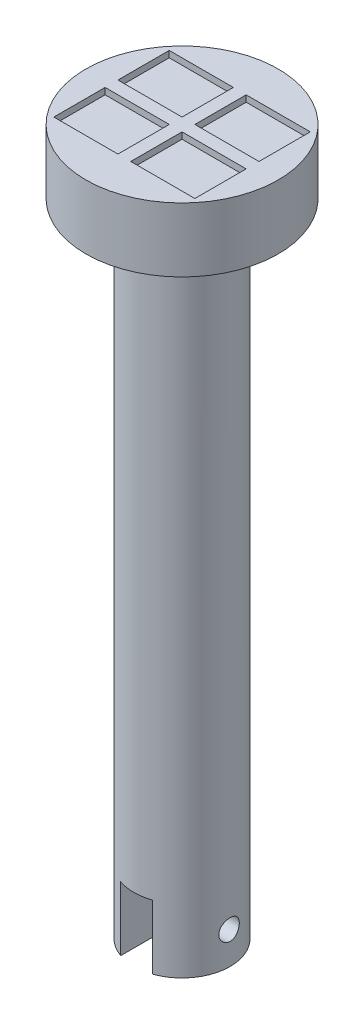
ISO-10303-21;
HEADER;
FILE_DESCRIPTION(('STEP AP214'),'2;1');
FILE_NAME('part.step','',(''),(''),'','','');
FILE_SCHEMA(('AUTOMOTIVE_DESIGN { 1 0 10303 214 1 1 1 1 }'));
ENDSEC;
DATA;
#1=APPLICATION_CONTEXT('core data for automotive mechanical design processes');
#2=APPLICATION_PROTOCOL_DEFINITION('international standard','automotive_design',2000,#1);
#3=PRODUCT_CONTEXT('',#1,'mechanical');
#4=PRODUCT('Part','Part','',(#3));
#5=PRODUCT_RELATED_PRODUCT_CATEGORY('part','',(#4));
#6=PRODUCT_DEFINITION_FORMATION('','',#4);
#7=PRODUCT_DEFINITION_CONTEXT('part definition',#1,'design');
#8=PRODUCT_DEFINITION('design','',#6,#7);
#9=PRODUCT_DEFINITION_SHAPE('','',#8);
#10=(LENGTH_UNIT() NAMED_UNIT(*) SI_UNIT(.MILLI.,.METRE.));
#11=(NAMED_UNIT(*) PLANE_ANGLE_UNIT() SI_UNIT($,.RADIAN.));
#12=(NAMED_UNIT(*) SI_UNIT($,.STERADIAN.) SOLID_ANGLE_UNIT());
#13=UNCERTAINTY_MEASURE_WITH_UNIT(LENGTH_MEASURE(1.E-05),#10,'distance_accuracy_value','');
#14=(GEOMETRIC_REPRESENTATION_CONTEXT(3) GLOBAL_UNCERTAINTY_ASSIGNED_CONTEXT((#13)) GLOBAL_UNIT_ASSIGNED_CONTEXT((#10,
#11,#12)) REPRESENTATION_CONTEXT('',''));
#15=CARTESIAN_POINT('',(0.,0.,0.));
#16=DIRECTION('',(0.,0.,1.));
#17=DIRECTION('',(1.,0.,0.));
#18=AXIS2_PLACEMENT_3D('',#15,#16,#17);
#19=CARTESIAN_POINT('',(0.,0.,0.));
#20=DIRECTION('',(0.,1.,0.));
#21=DIRECTION('',(0.,0.,1.));
#22=AXIS2_PLACEMENT_3D('',#19,#20,#21);
#23=PLANE('',#22);
#24=CARTESIAN_POINT('',(0.,0.,0.));
#25=DIRECTION('',(0.,1.,0.));
#26=DIRECTION('',(0.,0.,1.));
#27=AXIS2_PLACEMENT_3D('',#24,#25,#26);
#28=CIRCLE('',#27,7.5);
#29=CARTESIAN_POINT('',(-2.5,0.,-7.07106781186548));
#30=VERTEX_POINT('',#29);
#31=CARTESIAN_POINT('',(-2.5,0.,7.07106781186548));
#32=VERTEX_POINT('',#31);
#33=EDGE_CURVE('E377',#30,#32,#28,.T.);
#34=ORIENTED_EDGE('',*,*,#33,.F.);
#35=DIRECTION('',(0.,0.,1.));
#36=VECTOR('',#35,1.);
#37=CARTESIAN_POINT('',(-2.5,0.,0.));
#38=LINE('',#37,#36);
#39=EDGE_CURVE('E378',#30,#32,#38,.T.);
#40=ORIENTED_EDGE('',*,*,#39,.T.);
#41=EDGE_LOOP('',(#34,#40));
#42=FACE_BOUND('',#41,.T.);
#43=ADVANCED_FACE('F39',(#42),#23,.F.);
#44=CARTESIAN_POINT('',(0.,100.,0.));
#45=DIRECTION('',(0.,-1.,0.));
#46=DIRECTION('',(0.,0.,-1.));
#47=AXIS2_PLACEMENT_3D('',#44,#45,#46);
#48=CYLINDRICAL_SURFACE('',#47,7.5);
#49=CARTESIAN_POINT('',(-7.32734604068895,4.99999999999999,-1.6));
#50=CARTESIAN_POINT('',(-7.3273478320489,5.08876851007109,-1.59999687521768));
#51=CARTESIAN_POINT('',(-7.32897670533243,5.1775750992943,-1.59258752711157));
#52=CARTESIAN_POINT('',(-7.33530494590012,5.35266670741715,-1.56317603196586));
#53=CARTESIAN_POINT('',(-7.34000660314651,5.43894979556066,-1.54116300148996));
#54=CARTESIAN_POINT('',(-7.35192423987447,5.60643620667569,-1.48326555897742));
#55=CARTESIAN_POINT('',(-7.3591375365424,5.6876448412046,-1.44739594342864));
#56=CARTESIAN_POINT('',(-7.37526247893005,5.84289225870408,-1.36284536038589));
#57=CARTESIAN_POINT('',(-7.38417407205336,5.91693126361168,-1.31416478963062));
#58=CARTESIAN_POINT('',(-7.40285153964238,6.05692983916243,-1.20454002688148));
#59=CARTESIAN_POINT('',(-7.4126278874916,6.12275737738522,-1.14342897607145));
#60=CARTESIAN_POINT('',(-7.43184148234544,6.24330916231062,-1.01103827358584));
#61=CARTESIAN_POINT('',(-7.44127870373573,6.29803257175974,-0.9397578558276));
#62=CARTESIAN_POINT('',(-7.45886446546389,6.39534204711686,-0.788169783859917));
#63=CARTESIAN_POINT('',(-7.46699920907061,6.4378015699902,-0.707779159305541));
#64=CARTESIAN_POINT('',(-7.48094533800134,6.50855994533144,-0.540801563567203));
#65=CARTESIAN_POINT('',(-7.48675697112518,6.53686030819921,-0.454215254422203));
#66=CARTESIAN_POINT('',(-7.4953280596337,6.57808300960865,-0.278676257286044));
#67=CARTESIAN_POINT('',(-7.49813179441585,6.59122866317341,-0.189778209864773));
#68=CARTESIAN_POINT('',(-7.5005244520832,6.60246656338555,-0.010997287248264));
#69=CARTESIAN_POINT('',(-7.50011372555284,6.6005604516498,0.0788854794810483));
#70=CARTESIAN_POINT('',(-7.49615771852237,6.58191615631797,0.255546402374115));
#71=CARTESIAN_POINT('',(-7.49266329963279,6.56541862972291,0.342351262803162));
#72=CARTESIAN_POINT('',(-7.48299031427627,6.51844277484242,0.511931382190346));
#73=CARTESIAN_POINT('',(-7.47681163040705,6.48796383504569,0.594706464721115));
#74=CARTESIAN_POINT('',(-7.46238195623954,6.41367449572028,0.75455088288095));
#75=CARTESIAN_POINT('',(-7.45411671633686,6.36977196910885,0.831576062489073));
#76=CARTESIAN_POINT('',(-7.43642166419509,6.2699502243687,0.977254151163989));
#77=CARTESIAN_POINT('',(-7.4269917006231,6.21402944400459,1.04590596996944));
#78=CARTESIAN_POINT('',(-7.40778511114789,6.09044536673716,1.17431898714989));
#79=CARTESIAN_POINT('',(-7.39800531840365,6.02257143781813,1.23387717194844));
#80=CARTESIAN_POINT('',(-7.37937693038443,5.87769857523078,1.34080220178097));
#81=CARTESIAN_POINT('',(-7.37052835793311,5.80069941800689,1.38816874804634));
#82=CARTESIAN_POINT('',(-7.35475651444397,5.63944452104653,1.46945010087399));
#83=CARTESIAN_POINT('',(-7.34783851514439,5.55516971894304,1.50332818047938));
#84=CARTESIAN_POINT('',(-7.33678531116542,5.38194121509157,1.55638146230778));
#85=CARTESIAN_POINT('',(-7.33264968873186,5.29298821790475,1.57555887179257));
#86=CARTESIAN_POINT('',(-7.32771425542105,5.11477894000118,1.59835496135295));
#87=CARTESIAN_POINT('',(-7.32685123090565,5.02556208684322,1.60226852153074));
#88=CARTESIAN_POINT('',(-7.32838843572104,4.8477506677869,1.59522273599979));
#89=CARTESIAN_POINT('',(-7.33078845261626,4.75915606175547,1.58426435850705));
#90=CARTESIAN_POINT('',(-7.33852177157955,4.58612016761892,1.54804113817799));
#91=CARTESIAN_POINT('',(-7.34382205072082,4.50164357089464,1.52293726454489));
#92=CARTESIAN_POINT('',(-7.35672914405465,4.33809550071399,1.45930930111439));
#93=CARTESIAN_POINT('',(-7.36433617007512,4.25902452447174,1.42078397878081));
#94=CARTESIAN_POINT('',(-7.38113944964658,4.10725190691673,1.3307517679701));
#95=CARTESIAN_POINT('',(-7.39035742068727,4.03466097902885,1.27906237846837));
#96=CARTESIAN_POINT('',(-7.40928600589101,3.89907535110418,1.16440942349652));
#97=CARTESIAN_POINT('',(-7.41899667801202,3.83608178353944,1.10144452944021));
#98=CARTESIAN_POINT('',(-7.43802394390858,3.72034234685535,0.964696649513289));
#99=CARTESIAN_POINT('',(-7.44733055372857,3.66779703072941,0.8907422998811));
#100=CARTESIAN_POINT('',(-7.46432047157701,3.57587637439103,0.734884872162142));
#101=CARTESIAN_POINT('',(-7.47200385334325,3.53650043589062,0.65298215538974));
#102=CARTESIAN_POINT('',(-7.48483934479639,3.47231945842674,0.484049906499258));
#103=CARTESIAN_POINT('',(-7.49000699441327,3.44742477608375,0.397055665841016));
#104=CARTESIAN_POINT('',(-7.49729580275604,3.41263173205882,0.219997709997886));
#105=CARTESIAN_POINT('',(-7.49941738166686,3.40273130201045,0.129934419922702));
#106=CARTESIAN_POINT('',(-7.50036328067436,3.39829699175498,-0.0487977681305956));
#107=CARTESIAN_POINT('',(-7.49925198227476,3.40346307298598,-0.137459015607026));
#108=CARTESIAN_POINT('',(-7.49399416638132,3.42834658015261,-0.312618673313174));
#109=CARTESIAN_POINT('',(-7.48984769836304,3.44806376889427,-0.399117118774427));
#110=CARTESIAN_POINT('',(-7.47898934152454,3.50134901504737,-0.567277052878255));
#111=CARTESIAN_POINT('',(-7.47228498421878,3.53487643213245,-0.64895193649736));
#112=CARTESIAN_POINT('',(-7.45702850620361,3.61479002736396,-0.805557846294829));
#113=CARTESIAN_POINT('',(-7.44847621571813,3.66117738710898,-0.880488251937902));
#114=CARTESIAN_POINT('',(-7.43026476347602,3.76648248217596,-1.02294779578885));
#115=CARTESIAN_POINT('',(-7.42058833247677,3.82561231982063,-1.09031795731115));
#116=CARTESIAN_POINT('',(-7.40131497163696,3.95429363888893,-1.21428232218523));
#117=CARTESIAN_POINT('',(-7.39171806140063,4.02384761397617,-1.27087393971624));
#118=CARTESIAN_POINT('',(-7.37355623892386,4.17245456146851,-1.37235806742357));
#119=CARTESIAN_POINT('',(-7.36500582897484,4.25161602988675,-1.41709443670196));
#120=CARTESIAN_POINT('',(-7.3500858193436,4.41649726202727,-1.49255808840325));
#121=CARTESIAN_POINT('',(-7.34371433542935,4.5022112805218,-1.5232974824127));
#122=CARTESIAN_POINT('',(-7.33507966715627,4.65670463156019,-1.56426527791603));
#123=CARTESIAN_POINT('',(-7.3321984207885,4.72463247703799,-1.57764062026348));
#124=CARTESIAN_POINT('',(-7.32833095153541,4.86169921223266,-1.59550900254637));
#125=CARTESIAN_POINT('',(-7.32734464499187,4.93083804835045,-1.60000243460258));
#126=CARTESIAN_POINT('',(-7.32734604068895,4.99999999999999,-1.6));
#127=B_SPLINE_CURVE_WITH_KNOTS('',3,(#49,#50,#51,#52,#53,#54,#55,#56,#57,#58,#59,#60,#61,#62,
#63,#64,#65,#66,#67,#68,#69,#70,#71,#72,#73,#74,#75,#76,#77,#78,#79,#80,#81,#82,#83,#84,#85,#86,
#87,#88,#89,#90,#91,#92,#93,#94,#95,#96,#97,#98,#99,#100,#101,#102,#103,#104,#105,#106,#107,
#108,#109,#110,#111,#112,#113,#114,#115,#116,#117,#118,#119,#120,#121,#122,#123,#124,#125,#126),
.UNSPECIFIED.,.T.,.F.,(4,2,2,2,2,2,2,2,2,2,2,2,2,2,2,2,2,2,2,2,2,2,2,2,2,2,2,2,2,2,2,2,2,2,2,2,
2,2,4),(0.,0.266052129745754,0.532302758678047,0.798269859408134,1.06422872445041,
1.33402614177927,1.60384389433342,1.87635365044247,2.14883433092115,2.41724632343608,
2.68562904207089,2.94966617354387,3.21371485442776,3.47961802162733,3.74555577412269,
4.01676058380499,4.28797203900695,4.55991699098621,4.83182110323962,5.09844553370914,
5.36505260681318,5.62868536677038,5.89234234338366,6.15987500944547,6.42743921949375,
6.69972716505267,6.97200273882469,7.24257439749417,7.51310872903873,7.7782925828225,
8.04347211400599,8.30787679551559,8.57230577914046,8.84153310165343,9.11082493186948,
9.38350466142433,9.65594799064849,9.86324556645522,10.0705339902329),.UNSPECIFIED.);
#128=CARTESIAN_POINT('',(-7.32734604068895,4.99999999999999,-1.6));
#129=VERTEX_POINT('',#128);
#130=EDGE_CURVE('E322',#129,#129,#127,.T.);
#131=ORIENTED_EDGE('',*,*,#130,.T.);
#132=EDGE_LOOP('',(#131));
#133=FACE_BOUND('',#132,.T.);
#134=CARTESIAN_POINT('',(7.32734604068895,4.99999999999999,-1.6));
#135=CARTESIAN_POINT('',(7.3273478320489,4.9112314899289,-1.59999687521768));
#136=CARTESIAN_POINT('',(7.32897670533243,4.82242490070569,-1.59258752711157));
#137=CARTESIAN_POINT('',(7.33530494590012,4.64733329258284,-1.56317603196586));
#138=CARTESIAN_POINT('',(7.34000660314651,4.56105020443933,-1.54116300148996));
#139=CARTESIAN_POINT('',(7.35192423987447,4.3935637933243,-1.48326555897742));
#140=CARTESIAN_POINT('',(7.3591375365424,4.31235515879539,-1.44739594342864));
#141=CARTESIAN_POINT('',(7.37526247893005,4.15710774129591,-1.36284536038589));
#142=CARTESIAN_POINT('',(7.38417407205336,4.08306873638831,-1.31416478963062));
#143=CARTESIAN_POINT('',(7.40285153964238,3.94307016083756,-1.20454002688148));
#144=CARTESIAN_POINT('',(7.4126278874916,3.87724262261477,-1.14342897607145));
#145=CARTESIAN_POINT('',(7.43184148234544,3.75669083768937,-1.01103827358584));
#146=CARTESIAN_POINT('',(7.44127870373573,3.70196742824025,-0.9397578558276));
#147=CARTESIAN_POINT('',(7.45886446546389,3.60465795288313,-0.788169783859917));
#148=CARTESIAN_POINT('',(7.46699920907061,3.56219843000979,-0.707779159305541));
#149=CARTESIAN_POINT('',(7.48094533800134,3.49144005466855,-0.540801563567203));
#150=CARTESIAN_POINT('',(7.48675697112518,3.46313969180078,-0.454215254422203));
#151=CARTESIAN_POINT('',(7.4953280596337,3.42191699039134,-0.278676257286044));
#152=CARTESIAN_POINT('',(7.49813179441585,3.40877133682658,-0.189778209864773));
#153=CARTESIAN_POINT('',(7.5005244520832,3.39753343661444,-0.0109972872482639));
#154=CARTESIAN_POINT('',(7.50011372555284,3.39943954835019,0.0788854794810484));
#155=CARTESIAN_POINT('',(7.49615771852237,3.41808384368202,0.255546402374115));
#156=CARTESIAN_POINT('',(7.49266329963279,3.43458137027708,0.342351262803162));
#157=CARTESIAN_POINT('',(7.48299031427627,3.48155722515757,0.511931382190346));
#158=CARTESIAN_POINT('',(7.47681163040705,3.5120361649543,0.594706464721115));
#159=CARTESIAN_POINT('',(7.46238195623954,3.58632550427971,0.75455088288095));
#160=CARTESIAN_POINT('',(7.45411671633686,3.63022803089114,0.831576062489073));
#161=CARTESIAN_POINT('',(7.43642166419509,3.73004977563129,0.977254151163989));
#162=CARTESIAN_POINT('',(7.4269917006231,3.7859705559954,1.04590596996944));
#163=CARTESIAN_POINT('',(7.40778511114788,3.90955463326283,1.1743189871499));
#164=CARTESIAN_POINT('',(7.39800531840364,3.97742856218186,1.23387717194844));
#165=CARTESIAN_POINT('',(7.37937693038443,4.12230142476921,1.34080220178098));
#166=CARTESIAN_POINT('',(7.37052835793311,4.1993005819931,1.38816874804634));
#167=CARTESIAN_POINT('',(7.35475651444397,4.36055547895346,1.46945010087399));
#168=CARTESIAN_POINT('',(7.34783851514439,4.44483028105695,1.50332818047938));
#169=CARTESIAN_POINT('',(7.33678531116542,4.61805878490842,1.55638146230778));
#170=CARTESIAN_POINT('',(7.33264968873186,4.70701178209524,1.57555887179257));
#171=CARTESIAN_POINT('',(7.32771425542105,4.88522105999881,1.59835496135295));
#172=CARTESIAN_POINT('',(7.32685123090565,4.97443791315677,1.60226852153074));
#173=CARTESIAN_POINT('',(7.32838843572104,5.15224933221309,1.59522273599979));
#174=CARTESIAN_POINT('',(7.33078845261626,5.24084393824452,1.58426435850705));
#175=CARTESIAN_POINT('',(7.33852177157955,5.41387983238107,1.54804113817799));
#176=CARTESIAN_POINT('',(7.34382205072082,5.49835642910535,1.52293726454489));
#177=CARTESIAN_POINT('',(7.35672914405465,5.661904499286,1.45930930111439));
#178=CARTESIAN_POINT('',(7.36433617007512,5.74097547552824,1.42078397878081));
#179=CARTESIAN_POINT('',(7.38113944964658,5.89274809308326,1.3307517679701));
#180=CARTESIAN_POINT('',(7.39035742068727,5.96533902097114,1.27906237846837));
#181=CARTESIAN_POINT('',(7.40928600589101,6.10092464889581,1.16440942349652));
#182=CARTESIAN_POINT('',(7.41899667801202,6.16391821646055,1.10144452944021));
#183=CARTESIAN_POINT('',(7.43802394390858,6.27965765314464,0.964696649513289));
#184=CARTESIAN_POINT('',(7.44733055372857,6.33220296927058,0.890742299881099));
#185=CARTESIAN_POINT('',(7.46432047157701,6.42412362560896,0.734884872162141));
#186=CARTESIAN_POINT('',(7.47200385334325,6.46349956410937,0.65298215538974));
#187=CARTESIAN_POINT('',(7.48483934479639,6.52768054157325,0.484049906499258));
#188=CARTESIAN_POINT('',(7.49000699441327,6.55257522391624,0.397055665841016));
#189=CARTESIAN_POINT('',(7.49729580275604,6.58736826794117,0.219997709997886));
#190=CARTESIAN_POINT('',(7.49941738166686,6.59726869798954,0.129934419922702));
#191=CARTESIAN_POINT('',(7.50036328067436,6.60170300824501,-0.0487977681305959));
#192=CARTESIAN_POINT('',(7.49925198227476,6.59653692701401,-0.137459015607026));
#193=CARTESIAN_POINT('',(7.49399416638132,6.57165341984738,-0.312618673313175));
#194=CARTESIAN_POINT('',(7.48984769836304,6.55193623110572,-0.399117118774427));
#195=CARTESIAN_POINT('',(7.47898934152454,6.49865098495262,-0.567277052878256));
#196=CARTESIAN_POINT('',(7.47228498421878,6.46512356786754,-0.648951936497361));
#197=CARTESIAN_POINT('',(7.45702850620361,6.38520997263603,-0.80555784629483));
#198=CARTESIAN_POINT('',(7.44847621571813,6.33882261289101,-0.880488251937902));
#199=CARTESIAN_POINT('',(7.43026476347602,6.23351751782403,-1.02294779578885));
#200=CARTESIAN_POINT('',(7.42058833247677,6.17438768017936,-1.09031795731115));
#201=CARTESIAN_POINT('',(7.40131497163696,6.04570636111105,-1.21428232218523));
#202=CARTESIAN_POINT('',(7.39171806140063,5.97615238602382,-1.27087393971624));
#203=CARTESIAN_POINT('',(7.37355623892386,5.82754543853147,-1.37235806742357));
#204=CARTESIAN_POINT('',(7.36500582897484,5.74838397011324,-1.41709443670196));
#205=CARTESIAN_POINT('',(7.3500858193436,5.58350273797272,-1.49255808840325));
#206=CARTESIAN_POINT('',(7.34371433542935,5.49778871947819,-1.5232974824127));
#207=CARTESIAN_POINT('',(7.33507966715627,5.3432953684398,-1.56426527791603));
#208=CARTESIAN_POINT('',(7.3321984207885,5.275367522962,-1.57764062026348));
#209=CARTESIAN_POINT('',(7.32833095153541,5.13830078776733,-1.59550900254637));
#210=CARTESIAN_POINT('',(7.32734464499187,5.06916195164954,-1.60000243460258));
#211=CARTESIAN_POINT('',(7.32734604068895,4.99999999999999,-1.6));
#212=B_SPLINE_CURVE_WITH_KNOTS('',3,(#134,#135,#136,#137,#138,#139,#140,#141,#142,#143,#144,
#145,#146,#147,#148,#149,#150,#151,#152,#153,#154,#155,#156,#157,#158,#159,#160,#161,#162,#163,
#164,#165,#166,#167,#168,#169,#170,#171,#172,#173,#174,#175,#176,#177,#178,#179,#180,#181,#182,
#183,#184,#185,#186,#187,#188,#189,#190,#191,#192,#193,#194,#195,#196,#197,#198,#199,#200,#201,
#202,#203,#204,#205,#206,#207,#208,#209,#210,#211),.UNSPECIFIED.,.T.,.F.,(4,2,2,2,2,2,2,2,2,2,2,
2,2,2,2,2,2,2,2,2,2,2,2,2,2,2,2,2,2,2,2,2,2,2,2,2,2,2,4),(0.,0.266052129745754,
0.532302758678047,0.798269859408134,1.06422872445041,1.33402614177927,1.60384389433342,
1.87635365044247,2.14883433092115,2.41724632343608,2.68562904207089,2.94966617354387,
3.21371485442776,3.47961802162733,3.74555577412269,4.01676058380499,4.28797203900696,
4.55991699098621,4.83182110323962,5.09844553370915,5.36505260681318,5.62868536677038,
5.89234234338366,6.15987500944547,6.42743921949375,6.69972716505267,6.97200273882469,
7.24257439749418,7.51310872903873,7.7782925828225,8.04347211400599,8.30787679551559,
8.57230577914047,8.84153310165343,9.11082493186948,9.38350466142433,9.65594799064849,
9.86324556645522,10.0705339902329),.UNSPECIFIED.);
#213=CARTESIAN_POINT('',(7.32734604068895,4.99999999999999,-1.6));
#214=VERTEX_POINT('',#213);
#215=EDGE_CURVE('E315',#214,#214,#212,.T.);
#216=ORIENTED_EDGE('',*,*,#215,.T.);
#217=EDGE_LOOP('',(#216));
#218=FACE_BOUND('',#217,.T.);
#219=CARTESIAN_POINT('',(0.,100.,0.));
#220=DIRECTION('',(0.,1.,0.));
#221=DIRECTION('',(0.,0.,1.));
#222=AXIS2_PLACEMENT_3D('',#219,#220,#221);
#223=CIRCLE('',#222,7.5);
#224=CARTESIAN_POINT('',(0.,100.,7.5));
#225=VERTEX_POINT('',#224);
#226=EDGE_CURVE('E386',#225,#225,#223,.T.);
#227=ORIENTED_EDGE('',*,*,#226,.F.);
#228=EDGE_LOOP('',(#227));
#229=FACE_BOUND('',#228,.T.);
#230=ORIENTED_EDGE('',*,*,#33,.T.);
#231=DIRECTION('',(0.,-1.,0.));
#232=VECTOR('',#231,1.);
#233=CARTESIAN_POINT('',(-2.50000000000001,100.,7.07106781186547));
#234=LINE('',#233,#232);
#235=CARTESIAN_POINT('',(-2.5,9.99999999999999,7.07106781186548));
#236=VERTEX_POINT('',#235);
#237=EDGE_CURVE('E414',#32,#236,#234,.F.);
#238=ORIENTED_EDGE('',*,*,#237,.T.);
#239=CARTESIAN_POINT('',(0.,9.99999999999999,0.));
#240=DIRECTION('',(0.,1.,0.));
#241=DIRECTION('',(0.,0.,1.));
#242=AXIS2_PLACEMENT_3D('',#239,#240,#241);
#243=CIRCLE('',#242,7.5);
#244=CARTESIAN_POINT('',(2.5,10.,7.07106781186548));
#245=VERTEX_POINT('',#244);
#246=EDGE_CURVE('E11',#236,#245,#243,.T.);
#247=ORIENTED_EDGE('',*,*,#246,.T.);
#248=DIRECTION('',(0.,-1.,0.));
#249=VECTOR('',#248,1.);
#250=CARTESIAN_POINT('',(2.49999999999999,100.,7.07106781186548));
#251=LINE('',#250,#249);
#252=CARTESIAN_POINT('',(2.5,0.,7.07106781186548));
#253=VERTEX_POINT('',#252);
#254=EDGE_CURVE('E408',#245,#253,#251,.T.);
#255=ORIENTED_EDGE('',*,*,#254,.T.);
#256=CARTESIAN_POINT('',(2.5,0.,-7.07106781186548));
#257=VERTEX_POINT('',#256);
#258=EDGE_CURVE('E382',#253,#257,#28,.T.);
#259=ORIENTED_EDGE('',*,*,#258,.T.);
#260=DIRECTION('',(0.,-1.,0.));
#261=VECTOR('',#260,1.);
#262=CARTESIAN_POINT('',(2.49999999999999,100.,-7.07106781186548));
#263=LINE('',#262,#261);
#264=CARTESIAN_POINT('',(2.5,10.,-7.07106781186548));
#265=VERTEX_POINT('',#264);
#266=EDGE_CURVE('E399',#257,#265,#263,.F.);
#267=ORIENTED_EDGE('',*,*,#266,.T.);
#268=CARTESIAN_POINT('',(-2.5,9.99999999999999,-7.07106781186548));
#269=VERTEX_POINT('',#268);
#270=EDGE_CURVE('E49',#265,#269,#243,.T.);
#271=ORIENTED_EDGE('',*,*,#270,.T.);
#272=DIRECTION('',(0.,-1.,0.));
#273=VECTOR('',#272,1.);
#274=CARTESIAN_POINT('',(-2.50000000000001,100.,-7.07106781186547));
#275=LINE('',#274,#273);
#276=EDGE_CURVE('E398',#269,#30,#275,.T.);
#277=ORIENTED_EDGE('',*,*,#276,.T.);
#278=EDGE_LOOP('',(#230,#238,#247,#255,#259,#267,#271,#277));
#279=FACE_BOUND('',#278,.T.);
#280=ADVANCED_FACE('F41',(#133,#218,#229,#279),#48,.T.);
#281=ORIENTED_EDGE('',*,*,#258,.F.);
#282=DIRECTION('',(0.,0.,-1.));
#283=VECTOR('',#282,1.);
#284=CARTESIAN_POINT('',(2.5,0.,0.));
#285=LINE('',#284,#283);
#286=EDGE_CURVE('E393',#253,#257,#285,.T.);
#287=ORIENTED_EDGE('',*,*,#286,.T.);
#288=EDGE_LOOP('',(#281,#287));
#289=FACE_BOUND('',#288,.T.);
#290=ADVANCED_FACE('F359',(#289),#23,.F.);
#291=CARTESIAN_POINT('',(0.,110.,0.));
#292=DIRECTION('',(0.,-1.,0.));
#293=DIRECTION('',(0.,0.,-1.));
#294=AXIS2_PLACEMENT_3D('',#291,#292,#293);
#295=CYLINDRICAL_SURFACE('',#294,15.);
#296=CARTESIAN_POINT('',(0.,110.,0.));
#297=DIRECTION('',(0.,1.,0.));
#298=DIRECTION('',(0.,0.,1.));
#299=AXIS2_PLACEMENT_3D('',#296,#297,#298);
#300=CIRCLE('',#299,15.);
#301=CARTESIAN_POINT('',(0.,110.,15.));
#302=VERTEX_POINT('',#301);
#303=EDGE_CURVE('E383',#302,#302,#300,.T.);
#304=ORIENTED_EDGE('',*,*,#303,.F.);
#305=EDGE_LOOP('',(#304));
#306=FACE_BOUND('',#305,.T.);
#307=CARTESIAN_POINT('',(0.,100.,0.));
#308=DIRECTION('',(0.,1.,0.));
#309=DIRECTION('',(0.,0.,1.));
#310=AXIS2_PLACEMENT_3D('',#307,#308,#309);
#311=CIRCLE('',#310,15.);
#312=CARTESIAN_POINT('',(0.,100.,15.));
#313=VERTEX_POINT('',#312);
#314=EDGE_CURVE('E388',#313,#313,#311,.T.);
#315=ORIENTED_EDGE('',*,*,#314,.T.);
#316=EDGE_LOOP('',(#315));
#317=FACE_BOUND('',#316,.T.);
#318=ADVANCED_FACE('F353',(#306,#317),#295,.T.);
#319=CARTESIAN_POINT('',(0.,110.,0.));
#320=DIRECTION('',(0.,1.,0.));
#321=DIRECTION('',(0.,0.,1.));
#322=AXIS2_PLACEMENT_3D('',#319,#320,#321);
#323=PLANE('',#322);
#324=DIRECTION('',(0.,0.,1.));
#325=VECTOR('',#324,1.);
#326=CARTESIAN_POINT('',(-11.,110.,9.00000000000001));
#327=LINE('',#326,#325);
#328=CARTESIAN_POINT('',(-11.,110.,1.00000000000001));
#329=VERTEX_POINT('',#328);
#330=CARTESIAN_POINT('',(-11.,110.,9.00000000000001));
#331=VERTEX_POINT('',#330);
#332=EDGE_CURVE('E56',#329,#331,#327,.T.);
#333=ORIENTED_EDGE('',*,*,#332,.F.);
#334=DIRECTION('',(-1.,0.,0.));
#335=VECTOR('',#334,1.);
#336=CARTESIAN_POINT('',(-11.,110.,1.00000000000001));
#337=LINE('',#336,#335);
#338=CARTESIAN_POINT('',(-1.,110.,1.));
#339=VERTEX_POINT('',#338);
#340=EDGE_CURVE('E256',#339,#329,#337,.T.);
#341=ORIENTED_EDGE('',*,*,#340,.F.);
#342=DIRECTION('',(0.,0.,-1.));
#343=VECTOR('',#342,1.);
#344=CARTESIAN_POINT('',(-0.999999999999997,110.,9.));
#345=LINE('',#344,#343);
#346=CARTESIAN_POINT('',(-0.999999999999997,110.,9.));
#347=VERTEX_POINT('',#346);
#348=EDGE_CURVE('E270',#347,#339,#345,.T.);
#349=ORIENTED_EDGE('',*,*,#348,.F.);
#350=DIRECTION('',(1.,0.,0.));
#351=VECTOR('',#350,1.);
#352=CARTESIAN_POINT('',(-11.,110.,9.00000000000001));
#353=LINE('',#352,#351);
#354=EDGE_CURVE('E267',#331,#347,#353,.T.);
#355=ORIENTED_EDGE('',*,*,#354,.F.);
#356=EDGE_LOOP('',(#333,#341,#349,#355));
#357=FACE_BOUND('',#356,.T.);
#358=DIRECTION('',(1.,0.,0.));
#359=VECTOR('',#358,1.);
#360=CARTESIAN_POINT('',(11.,110.,9.00000000000001));
#361=LINE('',#360,#359);
#362=CARTESIAN_POINT('',(1.,110.,9.));
#363=VERTEX_POINT('',#362);
#364=CARTESIAN_POINT('',(11.,110.,9.00000000000001));
#365=VERTEX_POINT('',#364);
#366=EDGE_CURVE('E64',#363,#365,#361,.T.);
#367=ORIENTED_EDGE('',*,*,#366,.F.);
#368=DIRECTION('',(0.,0.,1.));
#369=VECTOR('',#368,1.);
#370=CARTESIAN_POINT('',(1.,110.,9.));
#371=LINE('',#370,#369);
#372=CARTESIAN_POINT('',(1.00000000000001,110.,1.));
#373=VERTEX_POINT('',#372);
#374=EDGE_CURVE('E226',#373,#363,#371,.T.);
#375=ORIENTED_EDGE('',*,*,#374,.F.);
#376=DIRECTION('',(-1.,0.,0.));
#377=VECTOR('',#376,1.);
#378=CARTESIAN_POINT('',(11.,110.,1.));
#379=LINE('',#378,#377);
#380=CARTESIAN_POINT('',(11.,110.,1.));
#381=VERTEX_POINT('',#380);
#382=EDGE_CURVE('E241',#381,#373,#379,.T.);
#383=ORIENTED_EDGE('',*,*,#382,.F.);
#384=DIRECTION('',(0.,0.,-1.));
#385=VECTOR('',#384,1.);
#386=CARTESIAN_POINT('',(11.,110.,9.00000000000001));
#387=LINE('',#386,#385);
#388=EDGE_CURVE('E237',#365,#381,#387,.T.);
#389=ORIENTED_EDGE('',*,*,#388,.F.);
#390=EDGE_LOOP('',(#367,#375,#383,#389));
#391=FACE_BOUND('',#390,.T.);
#392=DIRECTION('',(0.,0.,-1.));
#393=VECTOR('',#392,1.);
#394=CARTESIAN_POINT('',(11.,110.,-9.00000000000001));
#395=LINE('',#394,#393);
#396=CARTESIAN_POINT('',(11.,110.,-1.));
#397=VERTEX_POINT('',#396);
#398=CARTESIAN_POINT('',(11.,110.,-9.00000000000001));
#399=VERTEX_POINT('',#398);
#400=EDGE_CURVE('E185',#397,#399,#395,.T.);
#401=ORIENTED_EDGE('',*,*,#400,.F.);
#402=DIRECTION('',(1.,0.,0.));
#403=VECTOR('',#402,1.);
#404=CARTESIAN_POINT('',(11.,110.,-1.));
#405=LINE('',#404,#403);
#406=CARTESIAN_POINT('',(1.00000000000001,110.,-1.));
#407=VERTEX_POINT('',#406);
#408=EDGE_CURVE('E202',#407,#397,#405,.T.);
#409=ORIENTED_EDGE('',*,*,#408,.F.);
#410=DIRECTION('',(0.,0.,1.));
#411=VECTOR('',#410,1.);
#412=CARTESIAN_POINT('',(1.,110.,-9.));
#413=LINE('',#412,#411);
#414=CARTESIAN_POINT('',(1.,110.,-9.));
#415=VERTEX_POINT('',#414);
#416=EDGE_CURVE('E205',#415,#407,#413,.T.);
#417=ORIENTED_EDGE('',*,*,#416,.F.);
#418=DIRECTION('',(-1.,0.,0.));
#419=VECTOR('',#418,1.);
#420=CARTESIAN_POINT('',(11.,110.,-9.00000000000001));
#421=LINE('',#420,#419);
#422=EDGE_CURVE('E211',#399,#415,#421,.T.);
#423=ORIENTED_EDGE('',*,*,#422,.F.);
#424=EDGE_LOOP('',(#401,#409,#417,#423));
#425=FACE_BOUND('',#424,.T.);
#426=DIRECTION('',(0.,0.,1.));
#427=VECTOR('',#426,1.);
#428=CARTESIAN_POINT('',(-11.,110.,-9.));
#429=LINE('',#428,#427);
#430=CARTESIAN_POINT('',(-11.,110.,-9.));
#431=VERTEX_POINT('',#430);
#432=CARTESIAN_POINT('',(-11.,110.,-1.));
#433=VERTEX_POINT('',#432);
#434=EDGE_CURVE('E218',#431,#433,#429,.T.);
#435=ORIENTED_EDGE('',*,*,#434,.F.);
#436=DIRECTION('',(-1.,0.,0.));
#437=VECTOR('',#436,1.);
#438=CARTESIAN_POINT('',(-11.,110.,-9.));
#439=LINE('',#438,#437);
#440=CARTESIAN_POINT('',(-1.,110.,-9.));
#441=VERTEX_POINT('',#440);
#442=EDGE_CURVE('E285',#441,#431,#439,.T.);
#443=ORIENTED_EDGE('',*,*,#442,.F.);
#444=DIRECTION('',(0.,0.,-1.));
#445=VECTOR('',#444,1.);
#446=CARTESIAN_POINT('',(-1.,110.,-9.));
#447=LINE('',#446,#445);
#448=CARTESIAN_POINT('',(-1.,110.,-1.));
#449=VERTEX_POINT('',#448);
#450=EDGE_CURVE('E299',#449,#441,#447,.T.);
#451=ORIENTED_EDGE('',*,*,#450,.F.);
#452=DIRECTION('',(1.,0.,0.));
#453=VECTOR('',#452,1.);
#454=CARTESIAN_POINT('',(-11.,110.,-1.));
#455=LINE('',#454,#453);
#456=EDGE_CURVE('E296',#433,#449,#455,.T.);
#457=ORIENTED_EDGE('',*,*,#456,.F.);
#458=EDGE_LOOP('',(#435,#443,#451,#457));
#459=FACE_BOUND('',#458,.T.);
#460=ORIENTED_EDGE('',*,*,#303,.T.);
#461=EDGE_LOOP('',(#460));
#462=FACE_BOUND('',#461,.T.);
#463=ADVANCED_FACE('F350',(#357,#391,#425,#459,#462),#323,.T.);
#464=CARTESIAN_POINT('',(0.,100.,0.));
#465=DIRECTION('',(0.,1.,0.));
#466=DIRECTION('',(0.,0.,1.));
#467=AXIS2_PLACEMENT_3D('',#464,#465,#466);
#468=PLANE('',#467);
#469=ORIENTED_EDGE('',*,*,#226,.T.);
#470=EDGE_LOOP('',(#469));
#471=FACE_BOUND('',#470,.T.);
#472=ORIENTED_EDGE('',*,*,#314,.F.);
#473=EDGE_LOOP('',(#472));
#474=FACE_BOUND('',#473,.T.);
#475=ADVANCED_FACE('F341',(#471,#474),#468,.F.);
#476=CARTESIAN_POINT('',(-2.5,10.,-15.));
#477=DIRECTION('',(0.,1.,0.));
#478=DIRECTION('',(0.,0.,1.));
#479=AXIS2_PLACEMENT_3D('',#476,#477,#478);
#480=PLANE('',#479);
#481=DIRECTION('',(0.,0.,1.));
#482=VECTOR('',#481,1.);
#483=CARTESIAN_POINT('',(2.5,10.,-15.));
#484=LINE('',#483,#482);
#485=EDGE_CURVE('E403',#265,#245,#484,.T.);
#486=ORIENTED_EDGE('',*,*,#485,.T.);
#487=ORIENTED_EDGE('',*,*,#246,.F.);
#488=DIRECTION('',(0.,0.,1.));
#489=VECTOR('',#488,1.);
#490=CARTESIAN_POINT('',(-2.5,10.,-15.));
#491=LINE('',#490,#489);
#492=EDGE_CURVE('E405',#269,#236,#491,.T.);
#493=ORIENTED_EDGE('',*,*,#492,.F.);
#494=ORIENTED_EDGE('',*,*,#270,.F.);
#495=EDGE_LOOP('',(#486,#487,#493,#494));
#496=FACE_BOUND('',#495,.T.);
#497=ADVANCED_FACE('F336',(#496),#480,.F.);
#498=CARTESIAN_POINT('',(-2.5,0.,-15.));
#499=DIRECTION('',(-1.,0.,0.));
#500=DIRECTION('',(0.,-1.,0.));
#501=AXIS2_PLACEMENT_3D('',#498,#499,#500);
#502=PLANE('',#501);
#503=CARTESIAN_POINT('',(-2.5,4.99999999999999,0.));
#504=DIRECTION('',(-1.,0.,0.));
#505=DIRECTION('',(0.,-1.,0.));
#506=AXIS2_PLACEMENT_3D('',#503,#504,#505);
#507=CIRCLE('',#506,1.6);
#508=CARTESIAN_POINT('',(-2.5,3.4,0.));
#509=VERTEX_POINT('',#508);
#510=EDGE_CURVE('E312',#509,#509,#507,.T.);
#511=ORIENTED_EDGE('',*,*,#510,.T.);
#512=EDGE_LOOP('',(#511));
#513=FACE_BOUND('',#512,.T.);
#514=ORIENTED_EDGE('',*,*,#492,.T.);
#515=ORIENTED_EDGE('',*,*,#237,.F.);
#516=ORIENTED_EDGE('',*,*,#39,.F.);
#517=ORIENTED_EDGE('',*,*,#276,.F.);
#518=EDGE_LOOP('',(#514,#515,#516,#517));
#519=FACE_BOUND('',#518,.T.);
#520=ADVANCED_FACE('F340',(#513,#519),#502,.F.);
#521=CARTESIAN_POINT('',(2.5,0.,-15.));
#522=DIRECTION('',(1.,0.,0.));
#523=DIRECTION('',(0.,1.,0.));
#524=AXIS2_PLACEMENT_3D('',#521,#522,#523);
#525=PLANE('',#524);
#526=CARTESIAN_POINT('',(2.5,4.99999999999999,0.));
#527=DIRECTION('',(1.,0.,0.));
#528=DIRECTION('',(0.,1.,0.));
#529=AXIS2_PLACEMENT_3D('',#526,#527,#528);
#530=CIRCLE('',#529,1.6);
#531=CARTESIAN_POINT('',(2.5,6.59999999999999,0.));
#532=VERTEX_POINT('',#531);
#533=EDGE_CURVE('E44',#532,#532,#530,.T.);
#534=ORIENTED_EDGE('',*,*,#533,.T.);
#535=EDGE_LOOP('',(#534));
#536=FACE_BOUND('',#535,.T.);
#537=ORIENTED_EDGE('',*,*,#485,.F.);
#538=ORIENTED_EDGE('',*,*,#266,.F.);
#539=ORIENTED_EDGE('',*,*,#286,.F.);
#540=ORIENTED_EDGE('',*,*,#254,.F.);
#541=EDGE_LOOP('',(#537,#538,#539,#540));
#542=FACE_BOUND('',#541,.T.);
#543=ADVANCED_FACE('F343',(#536,#542),#525,.F.);
#544=CARTESIAN_POINT('',(-15.,4.99999999999999,0.));
#545=DIRECTION('',(1.,0.,0.));
#546=DIRECTION('',(0.,0.,-1.));
#547=AXIS2_PLACEMENT_3D('',#544,#545,#546);
#548=CYLINDRICAL_SURFACE('',#547,1.6);
#549=ORIENTED_EDGE('',*,*,#533,.F.);
#550=EDGE_LOOP('',(#549));
#551=FACE_BOUND('',#550,.T.);
#552=ORIENTED_EDGE('',*,*,#215,.F.);
#553=EDGE_LOOP('',(#552));
#554=FACE_BOUND('',#553,.T.);
#555=ADVANCED_FACE('F333',(#551,#554),#548,.F.);
#556=ORIENTED_EDGE('',*,*,#510,.F.);
#557=EDGE_LOOP('',(#556));
#558=FACE_BOUND('',#557,.T.);
#559=ORIENTED_EDGE('',*,*,#130,.F.);
#560=EDGE_LOOP('',(#559));
#561=FACE_BOUND('',#560,.T.);
#562=ADVANCED_FACE('F327',(#558,#561),#548,.F.);
#563=CARTESIAN_POINT('',(-11.,109.,-9.));
#564=DIRECTION('',(-1.,0.,0.));
#565=DIRECTION('',(0.,0.,1.));
#566=AXIS2_PLACEMENT_3D('',#563,#564,#565);
#567=PLANE('',#566);
#568=ORIENTED_EDGE('',*,*,#434,.T.);
#569=DIRECTION('',(0.,1.,0.));
#570=VECTOR('',#569,1.);
#571=CARTESIAN_POINT('',(-11.,109.,-1.));
#572=LINE('',#571,#570);
#573=CARTESIAN_POINT('',(-11.,109.,-1.));
#574=VERTEX_POINT('',#573);
#575=EDGE_CURVE('E294',#574,#433,#572,.T.);
#576=ORIENTED_EDGE('',*,*,#575,.F.);
#577=DIRECTION('',(0.,0.,1.));
#578=VECTOR('',#577,1.);
#579=CARTESIAN_POINT('',(-11.,109.,-9.));
#580=LINE('',#579,#578);
#581=CARTESIAN_POINT('',(-11.,109.,-9.));
#582=VERTEX_POINT('',#581);
#583=EDGE_CURVE('E281',#582,#574,#580,.T.);
#584=ORIENTED_EDGE('',*,*,#583,.F.);
#585=DIRECTION('',(0.,1.,0.));
#586=VECTOR('',#585,1.);
#587=CARTESIAN_POINT('',(-11.,109.,-9.));
#588=LINE('',#587,#586);
#589=EDGE_CURVE('E304',#582,#431,#588,.T.);
#590=ORIENTED_EDGE('',*,*,#589,.T.);
#591=EDGE_LOOP('',(#568,#576,#584,#590));
#592=FACE_BOUND('',#591,.T.);
#593=ADVANCED_FACE('F332',(#592),#567,.F.);
#594=CARTESIAN_POINT('',(-11.,109.,-9.));
#595=DIRECTION('',(0.,0.,-1.));
#596=DIRECTION('',(-1.,0.,0.));
#597=AXIS2_PLACEMENT_3D('',#594,#595,#596);
#598=PLANE('',#597);
#599=ORIENTED_EDGE('',*,*,#442,.T.);
#600=ORIENTED_EDGE('',*,*,#589,.F.);
#601=DIRECTION('',(-1.,0.,0.));
#602=VECTOR('',#601,1.);
#603=CARTESIAN_POINT('',(-11.,109.,-9.));
#604=LINE('',#603,#602);
#605=CARTESIAN_POINT('',(-1.,109.,-9.));
#606=VERTEX_POINT('',#605);
#607=EDGE_CURVE('E291',#606,#582,#604,.T.);
#608=ORIENTED_EDGE('',*,*,#607,.F.);
#609=DIRECTION('',(0.,1.,0.));
#610=VECTOR('',#609,1.);
#611=CARTESIAN_POINT('',(-1.,109.,-9.));
#612=LINE('',#611,#610);
#613=EDGE_CURVE('E306',#606,#441,#612,.T.);
#614=ORIENTED_EDGE('',*,*,#613,.T.);
#615=EDGE_LOOP('',(#599,#600,#608,#614));
#616=FACE_BOUND('',#615,.T.);
#617=ADVANCED_FACE('F447',(#616),#598,.F.);
#618=CARTESIAN_POINT('',(-1.,109.,-9.));
#619=DIRECTION('',(1.,0.,0.));
#620=DIRECTION('',(0.,0.,-1.));
#621=AXIS2_PLACEMENT_3D('',#618,#619,#620);
#622=PLANE('',#621);
#623=ORIENTED_EDGE('',*,*,#450,.T.);
#624=ORIENTED_EDGE('',*,*,#613,.F.);
#625=DIRECTION('',(0.,0.,-1.));
#626=VECTOR('',#625,1.);
#627=CARTESIAN_POINT('',(-1.,109.,-9.));
#628=LINE('',#627,#626);
#629=CARTESIAN_POINT('',(-1.,109.,-1.));
#630=VERTEX_POINT('',#629);
#631=EDGE_CURVE('E288',#630,#606,#628,.T.);
#632=ORIENTED_EDGE('',*,*,#631,.F.);
#633=DIRECTION('',(0.,1.,0.));
#634=VECTOR('',#633,1.);
#635=CARTESIAN_POINT('',(-1.,109.,-1.));
#636=LINE('',#635,#634);
#637=EDGE_CURVE('E308',#630,#449,#636,.T.);
#638=ORIENTED_EDGE('',*,*,#637,.T.);
#639=EDGE_LOOP('',(#623,#624,#632,#638));
#640=FACE_BOUND('',#639,.T.);
#641=ADVANCED_FACE('F454',(#640),#622,.F.);
#642=CARTESIAN_POINT('',(-11.,109.,-1.));
#643=DIRECTION('',(0.,0.,1.));
#644=DIRECTION('',(1.,0.,0.));
#645=AXIS2_PLACEMENT_3D('',#642,#643,#644);
#646=PLANE('',#645);
#647=ORIENTED_EDGE('',*,*,#456,.T.);
#648=ORIENTED_EDGE('',*,*,#637,.F.);
#649=DIRECTION('',(1.,0.,0.));
#650=VECTOR('',#649,1.);
#651=CARTESIAN_POINT('',(-11.,109.,-1.));
#652=LINE('',#651,#650);
#653=EDGE_CURVE('E284',#574,#630,#652,.T.);
#654=ORIENTED_EDGE('',*,*,#653,.F.);
#655=ORIENTED_EDGE('',*,*,#575,.T.);
#656=EDGE_LOOP('',(#647,#648,#654,#655));
#657=FACE_BOUND('',#656,.T.);
#658=ADVANCED_FACE('F462',(#657),#646,.F.);
#659=CARTESIAN_POINT('',(0.,109.,0.));
#660=DIRECTION('',(0.,1.,0.));
#661=DIRECTION('',(0.,0.,1.));
#662=AXIS2_PLACEMENT_3D('',#659,#660,#661);
#663=PLANE('',#662);
#664=ORIENTED_EDGE('',*,*,#583,.T.);
#665=ORIENTED_EDGE('',*,*,#653,.T.);
#666=ORIENTED_EDGE('',*,*,#631,.T.);
#667=ORIENTED_EDGE('',*,*,#607,.T.);
#668=EDGE_LOOP('',(#664,#665,#666,#667));
#669=FACE_BOUND('',#668,.T.);
#670=ADVANCED_FACE('F470',(#669),#663,.T.);
#671=CARTESIAN_POINT('',(11.,109.,-9.00000000000001));
#672=DIRECTION('',(1.,0.,0.));
#673=DIRECTION('',(0.,0.,-1.));
#674=AXIS2_PLACEMENT_3D('',#671,#672,#673);
#675=PLANE('',#674);
#676=ORIENTED_EDGE('',*,*,#400,.T.);
#677=DIRECTION('',(0.,1.,0.));
#678=VECTOR('',#677,1.);
#679=CARTESIAN_POINT('',(11.,109.,-9.00000000000001));
#680=LINE('',#679,#678);
#681=CARTESIAN_POINT('',(11.,109.,-9.00000000000001));
#682=VERTEX_POINT('',#681);
#683=EDGE_CURVE('E178',#682,#399,#680,.T.);
#684=ORIENTED_EDGE('',*,*,#683,.F.);
#685=DIRECTION('',(0.,0.,-1.));
#686=VECTOR('',#685,1.);
#687=CARTESIAN_POINT('',(11.,109.,-9.00000000000001));
#688=LINE('',#687,#686);
#689=CARTESIAN_POINT('',(11.,109.,-1.));
#690=VERTEX_POINT('',#689);
#691=EDGE_CURVE('E182',#690,#682,#688,.T.);
#692=ORIENTED_EDGE('',*,*,#691,.F.);
#693=DIRECTION('',(0.,1.,0.));
#694=VECTOR('',#693,1.);
#695=CARTESIAN_POINT('',(11.,109.,-1.));
#696=LINE('',#695,#694);
#697=EDGE_CURVE('E216',#690,#397,#696,.T.);
#698=ORIENTED_EDGE('',*,*,#697,.T.);
#699=EDGE_LOOP('',(#676,#684,#692,#698));
#700=FACE_BOUND('',#699,.T.);
#701=ADVANCED_FACE('F180',(#700),#675,.F.);
#702=CARTESIAN_POINT('',(11.,109.,-1.));
#703=DIRECTION('',(0.,0.,1.));
#704=DIRECTION('',(1.,0.,0.));
#705=AXIS2_PLACEMENT_3D('',#702,#703,#704);
#706=PLANE('',#705);
#707=ORIENTED_EDGE('',*,*,#408,.T.);
#708=ORIENTED_EDGE('',*,*,#697,.F.);
#709=DIRECTION('',(1.,0.,0.));
#710=VECTOR('',#709,1.);
#711=CARTESIAN_POINT('',(11.,109.,-1.));
#712=LINE('',#711,#710);
#713=CARTESIAN_POINT('',(1.00000000000001,109.,-1.));
#714=VERTEX_POINT('',#713);
#715=EDGE_CURVE('E190',#714,#690,#712,.T.);
#716=ORIENTED_EDGE('',*,*,#715,.F.);
#717=DIRECTION('',(0.,1.,0.));
#718=VECTOR('',#717,1.);
#719=CARTESIAN_POINT('',(1.00000000000001,109.,-1.));
#720=LINE('',#719,#718);
#721=EDGE_CURVE('E219',#714,#407,#720,.T.);
#722=ORIENTED_EDGE('',*,*,#721,.T.);
#723=EDGE_LOOP('',(#707,#708,#716,#722));
#724=FACE_BOUND('',#723,.T.);
#725=ADVANCED_FACE('F484',(#724),#706,.F.);
#726=CARTESIAN_POINT('',(1.,109.,-9.));
#727=DIRECTION('',(-1.,0.,0.));
#728=DIRECTION('',(0.,0.,1.));
#729=AXIS2_PLACEMENT_3D('',#726,#727,#728);
#730=PLANE('',#729);
#731=ORIENTED_EDGE('',*,*,#416,.T.);
#732=ORIENTED_EDGE('',*,*,#721,.F.);
#733=DIRECTION('',(0.,0.,1.));
#734=VECTOR('',#733,1.);
#735=CARTESIAN_POINT('',(1.,109.,-9.));
#736=LINE('',#735,#734);
#737=CARTESIAN_POINT('',(1.,109.,-9.));
#738=VERTEX_POINT('',#737);
#739=EDGE_CURVE('E198',#738,#714,#736,.T.);
#740=ORIENTED_EDGE('',*,*,#739,.F.);
#741=DIRECTION('',(0.,1.,0.));
#742=VECTOR('',#741,1.);
#743=CARTESIAN_POINT('',(1.,109.,-9.));
#744=LINE('',#743,#742);
#745=EDGE_CURVE('E189',#738,#415,#744,.T.);
#746=ORIENTED_EDGE('',*,*,#745,.T.);
#747=EDGE_LOOP('',(#731,#732,#740,#746));
#748=FACE_BOUND('',#747,.T.);
#749=ADVANCED_FACE('F491',(#748),#730,.F.);
#750=CARTESIAN_POINT('',(11.,109.,-9.00000000000001));
#751=DIRECTION('',(0.,0.,-1.));
#752=DIRECTION('',(-1.,0.,0.));
#753=AXIS2_PLACEMENT_3D('',#750,#751,#752);
#754=PLANE('',#753);
#755=ORIENTED_EDGE('',*,*,#422,.T.);
#756=ORIENTED_EDGE('',*,*,#745,.F.);
#757=DIRECTION('',(-1.,0.,0.));
#758=VECTOR('',#757,1.);
#759=CARTESIAN_POINT('',(11.,109.,-9.00000000000001));
#760=LINE('',#759,#758);
#761=EDGE_CURVE('E193',#682,#738,#760,.T.);
#762=ORIENTED_EDGE('',*,*,#761,.F.);
#763=ORIENTED_EDGE('',*,*,#683,.T.);
#764=EDGE_LOOP('',(#755,#756,#762,#763));
#765=FACE_BOUND('',#764,.T.);
#766=ADVANCED_FACE('F194',(#765),#754,.F.);
#767=CARTESIAN_POINT('',(0.,109.,0.));
#768=DIRECTION('',(0.,-1.,0.));
#769=DIRECTION('',(0.,0.,-1.));
#770=AXIS2_PLACEMENT_3D('',#767,#768,#769);
#771=PLANE('',#770);
#772=ORIENTED_EDGE('',*,*,#691,.T.);
#773=ORIENTED_EDGE('',*,*,#761,.T.);
#774=ORIENTED_EDGE('',*,*,#739,.T.);
#775=ORIENTED_EDGE('',*,*,#715,.T.);
#776=EDGE_LOOP('',(#772,#773,#774,#775));
#777=FACE_BOUND('',#776,.T.);
#778=ADVANCED_FACE('F200',(#777),#771,.F.);
#779=CARTESIAN_POINT('',(11.,109.,9.00000000000001));
#780=DIRECTION('',(0.,0.,1.));
#781=DIRECTION('',(1.,0.,0.));
#782=AXIS2_PLACEMENT_3D('',#779,#780,#781);
#783=PLANE('',#782);
#784=ORIENTED_EDGE('',*,*,#366,.T.);
#785=DIRECTION('',(0.,1.,0.));
#786=VECTOR('',#785,1.);
#787=CARTESIAN_POINT('',(11.,109.,9.00000000000001));
#788=LINE('',#787,#786);
#789=CARTESIAN_POINT('',(11.,109.,9.00000000000001));
#790=VERTEX_POINT('',#789);
#791=EDGE_CURVE('E235',#790,#365,#788,.T.);
#792=ORIENTED_EDGE('',*,*,#791,.F.);
#793=DIRECTION('',(1.,0.,0.));
#794=VECTOR('',#793,1.);
#795=CARTESIAN_POINT('',(11.,109.,9.00000000000001));
#796=LINE('',#795,#794);
#797=CARTESIAN_POINT('',(1.,109.,9.));
#798=VERTEX_POINT('',#797);
#799=EDGE_CURVE('E222',#798,#790,#796,.T.);
#800=ORIENTED_EDGE('',*,*,#799,.F.);
#801=DIRECTION('',(0.,1.,0.));
#802=VECTOR('',#801,1.);
#803=CARTESIAN_POINT('',(1.,109.,9.));
#804=LINE('',#803,#802);
#805=EDGE_CURVE('E212',#798,#363,#804,.T.);
#806=ORIENTED_EDGE('',*,*,#805,.T.);
#807=EDGE_LOOP('',(#784,#792,#800,#806));
#808=FACE_BOUND('',#807,.T.);
#809=ADVANCED_FACE('F512',(#808),#783,.F.);
#810=CARTESIAN_POINT('',(1.,109.,9.));
#811=DIRECTION('',(-1.,0.,0.));
#812=DIRECTION('',(0.,0.,1.));
#813=AXIS2_PLACEMENT_3D('',#810,#811,#812);
#814=PLANE('',#813);
#815=ORIENTED_EDGE('',*,*,#374,.T.);
#816=ORIENTED_EDGE('',*,*,#805,.F.);
#817=DIRECTION('',(0.,0.,1.));
#818=VECTOR('',#817,1.);
#819=CARTESIAN_POINT('',(1.,109.,9.));
#820=LINE('',#819,#818);
#821=CARTESIAN_POINT('',(1.00000000000001,109.,1.));
#822=VERTEX_POINT('',#821);
#823=EDGE_CURVE('E232',#822,#798,#820,.T.);
#824=ORIENTED_EDGE('',*,*,#823,.F.);
#825=DIRECTION('',(0.,1.,0.));
#826=VECTOR('',#825,1.);
#827=CARTESIAN_POINT('',(1.00000000000001,109.,1.));
#828=LINE('',#827,#826);
#829=EDGE_CURVE('E247',#822,#373,#828,.T.);
#830=ORIENTED_EDGE('',*,*,#829,.T.);
#831=EDGE_LOOP('',(#815,#816,#824,#830));
#832=FACE_BOUND('',#831,.T.);
#833=ADVANCED_FACE('F519',(#832),#814,.F.);
#834=CARTESIAN_POINT('',(11.,109.,1.));
#835=DIRECTION('',(0.,0.,-1.));
#836=DIRECTION('',(-1.,0.,0.));
#837=AXIS2_PLACEMENT_3D('',#834,#835,#836);
#838=PLANE('',#837);
#839=ORIENTED_EDGE('',*,*,#382,.T.);
#840=ORIENTED_EDGE('',*,*,#829,.F.);
#841=DIRECTION('',(-1.,0.,0.));
#842=VECTOR('',#841,1.);
#843=CARTESIAN_POINT('',(11.,109.,1.));
#844=LINE('',#843,#842);
#845=CARTESIAN_POINT('',(11.,109.,1.));
#846=VERTEX_POINT('',#845);
#847=EDGE_CURVE('E229',#846,#822,#844,.T.);
#848=ORIENTED_EDGE('',*,*,#847,.F.);
#849=DIRECTION('',(0.,1.,0.));
#850=VECTOR('',#849,1.);
#851=CARTESIAN_POINT('',(11.,109.,1.));
#852=LINE('',#851,#850);
#853=EDGE_CURVE('E249',#846,#381,#852,.T.);
#854=ORIENTED_EDGE('',*,*,#853,.T.);
#855=EDGE_LOOP('',(#839,#840,#848,#854));
#856=FACE_BOUND('',#855,.T.);
#857=ADVANCED_FACE('F526',(#856),#838,.F.);
#858=CARTESIAN_POINT('',(11.,109.,9.00000000000001));
#859=DIRECTION('',(1.,0.,0.));
#860=DIRECTION('',(0.,0.,-1.));
#861=AXIS2_PLACEMENT_3D('',#858,#859,#860);
#862=PLANE('',#861);
#863=ORIENTED_EDGE('',*,*,#388,.T.);
#864=ORIENTED_EDGE('',*,*,#853,.F.);
#865=DIRECTION('',(0.,0.,-1.));
#866=VECTOR('',#865,1.);
#867=CARTESIAN_POINT('',(11.,109.,9.00000000000001));
#868=LINE('',#867,#866);
#869=EDGE_CURVE('E225',#790,#846,#868,.T.);
#870=ORIENTED_EDGE('',*,*,#869,.F.);
#871=ORIENTED_EDGE('',*,*,#791,.T.);
#872=EDGE_LOOP('',(#863,#864,#870,#871));
#873=FACE_BOUND('',#872,.T.);
#874=ADVANCED_FACE('F534',(#873),#862,.F.);
#875=CARTESIAN_POINT('',(0.,109.,0.));
#876=DIRECTION('',(0.,-1.,0.));
#877=DIRECTION('',(0.,0.,-1.));
#878=AXIS2_PLACEMENT_3D('',#875,#876,#877);
#879=PLANE('',#878);
#880=ORIENTED_EDGE('',*,*,#799,.T.);
#881=ORIENTED_EDGE('',*,*,#869,.T.);
#882=ORIENTED_EDGE('',*,*,#847,.T.);
#883=ORIENTED_EDGE('',*,*,#823,.T.);
#884=EDGE_LOOP('',(#880,#881,#882,#883));
#885=FACE_BOUND('',#884,.T.);
#886=ADVANCED_FACE('F542',(#885),#879,.F.);
#887=CARTESIAN_POINT('',(-11.,109.,9.00000000000001));
#888=DIRECTION('',(-1.,0.,0.));
#889=DIRECTION('',(0.,0.,1.));
#890=AXIS2_PLACEMENT_3D('',#887,#888,#889);
#891=PLANE('',#890);
#892=ORIENTED_EDGE('',*,*,#332,.T.);
#893=DIRECTION('',(0.,1.,0.));
#894=VECTOR('',#893,1.);
#895=CARTESIAN_POINT('',(-11.,109.,9.00000000000001));
#896=LINE('',#895,#894);
#897=CARTESIAN_POINT('',(-11.,109.,9.00000000000001));
#898=VERTEX_POINT('',#897);
#899=EDGE_CURVE('E265',#898,#331,#896,.T.);
#900=ORIENTED_EDGE('',*,*,#899,.F.);
#901=DIRECTION('',(0.,0.,1.));
#902=VECTOR('',#901,1.);
#903=CARTESIAN_POINT('',(-11.,109.,9.00000000000001));
#904=LINE('',#903,#902);
#905=CARTESIAN_POINT('',(-11.,109.,1.00000000000001));
#906=VERTEX_POINT('',#905);
#907=EDGE_CURVE('E252',#906,#898,#904,.T.);
#908=ORIENTED_EDGE('',*,*,#907,.F.);
#909=DIRECTION('',(0.,1.,0.));
#910=VECTOR('',#909,1.);
#911=CARTESIAN_POINT('',(-11.,109.,1.00000000000001));
#912=LINE('',#911,#910);
#913=EDGE_CURVE('E238',#906,#329,#912,.T.);
#914=ORIENTED_EDGE('',*,*,#913,.T.);
#915=EDGE_LOOP('',(#892,#900,#908,#914));
#916=FACE_BOUND('',#915,.T.);
#917=ADVANCED_FACE('F550',(#916),#891,.F.);
#918=CARTESIAN_POINT('',(-11.,109.,1.00000000000001));
#919=DIRECTION('',(0.,0.,-1.));
#920=DIRECTION('',(-1.,0.,0.));
#921=AXIS2_PLACEMENT_3D('',#918,#919,#920);
#922=PLANE('',#921);
#923=ORIENTED_EDGE('',*,*,#340,.T.);
#924=ORIENTED_EDGE('',*,*,#913,.F.);
#925=DIRECTION('',(-1.,0.,0.));
#926=VECTOR('',#925,1.);
#927=CARTESIAN_POINT('',(-11.,109.,1.00000000000001));
#928=LINE('',#927,#926);
#929=CARTESIAN_POINT('',(-1.,109.,1.));
#930=VERTEX_POINT('',#929);
#931=EDGE_CURVE('E262',#930,#906,#928,.T.);
#932=ORIENTED_EDGE('',*,*,#931,.F.);
#933=DIRECTION('',(0.,1.,0.));
#934=VECTOR('',#933,1.);
#935=CARTESIAN_POINT('',(-1.,109.,1.));
#936=LINE('',#935,#934);
#937=EDGE_CURVE('E276',#930,#339,#936,.T.);
#938=ORIENTED_EDGE('',*,*,#937,.T.);
#939=EDGE_LOOP('',(#923,#924,#932,#938));
#940=FACE_BOUND('',#939,.T.);
#941=ADVANCED_FACE('F558',(#940),#922,.F.);
#942=CARTESIAN_POINT('',(-0.999999999999997,109.,9.));
#943=DIRECTION('',(1.,0.,0.));
#944=DIRECTION('',(0.,0.,-1.));
#945=AXIS2_PLACEMENT_3D('',#942,#943,#944);
#946=PLANE('',#945);
#947=ORIENTED_EDGE('',*,*,#348,.T.);
#948=ORIENTED_EDGE('',*,*,#937,.F.);
#949=DIRECTION('',(0.,0.,-1.));
#950=VECTOR('',#949,1.);
#951=CARTESIAN_POINT('',(-0.999999999999997,109.,9.));
#952=LINE('',#951,#950);
#953=CARTESIAN_POINT('',(-0.999999999999997,109.,9.));
#954=VERTEX_POINT('',#953);
#955=EDGE_CURVE('E259',#954,#930,#952,.T.);
#956=ORIENTED_EDGE('',*,*,#955,.F.);
#957=DIRECTION('',(0.,1.,0.));
#958=VECTOR('',#957,1.);
#959=CARTESIAN_POINT('',(-0.999999999999997,109.,9.));
#960=LINE('',#959,#958);
#961=EDGE_CURVE('E278',#954,#347,#960,.T.);
#962=ORIENTED_EDGE('',*,*,#961,.T.);
#963=EDGE_LOOP('',(#947,#948,#956,#962));
#964=FACE_BOUND('',#963,.T.);
#965=ADVANCED_FACE('F565',(#964),#946,.F.);
#966=CARTESIAN_POINT('',(-11.,109.,9.00000000000001));
#967=DIRECTION('',(0.,0.,1.));
#968=DIRECTION('',(1.,0.,0.));
#969=AXIS2_PLACEMENT_3D('',#966,#967,#968);
#970=PLANE('',#969);
#971=ORIENTED_EDGE('',*,*,#354,.T.);
#972=ORIENTED_EDGE('',*,*,#961,.F.);
#973=DIRECTION('',(1.,0.,0.));
#974=VECTOR('',#973,1.);
#975=CARTESIAN_POINT('',(-11.,109.,9.00000000000001));
#976=LINE('',#975,#974);
#977=EDGE_CURVE('E255',#898,#954,#976,.T.);
#978=ORIENTED_EDGE('',*,*,#977,.F.);
#979=ORIENTED_EDGE('',*,*,#899,.T.);
#980=EDGE_LOOP('',(#971,#972,#978,#979));
#981=FACE_BOUND('',#980,.T.);
#982=ADVANCED_FACE('F573',(#981),#970,.F.);
#983=CARTESIAN_POINT('',(0.,109.,0.));
#984=DIRECTION('',(0.,-1.,0.));
#985=DIRECTION('',(0.,0.,-1.));
#986=AXIS2_PLACEMENT_3D('',#983,#984,#985);
#987=PLANE('',#986);
#988=ORIENTED_EDGE('',*,*,#907,.T.);
#989=ORIENTED_EDGE('',*,*,#977,.T.);
#990=ORIENTED_EDGE('',*,*,#955,.T.);
#991=ORIENTED_EDGE('',*,*,#931,.T.);
#992=EDGE_LOOP('',(#988,#989,#990,#991));
#993=FACE_BOUND('',#992,.T.);
#994=ADVANCED_FACE('F581',(#993),#987,.F.);
#995=CLOSED_SHELL('',(#43,#280,#290,#318,#463,#475,#497,#520,#543,#555,#562,#593,#617,#641,#658,
#670,#701,#725,#749,#766,#778,#809,#833,#857,#874,#886,#917,#941,#965,#982,#994));
#996=MANIFOLD_SOLID_BREP('B2',#995);
#997=ADVANCED_BREP_SHAPE_REPRESENTATION('',(#18,#996),#14);
#998=SHAPE_DEFINITION_REPRESENTATION(#9,#997);
ENDSEC;
END-ISO-10303-21;
